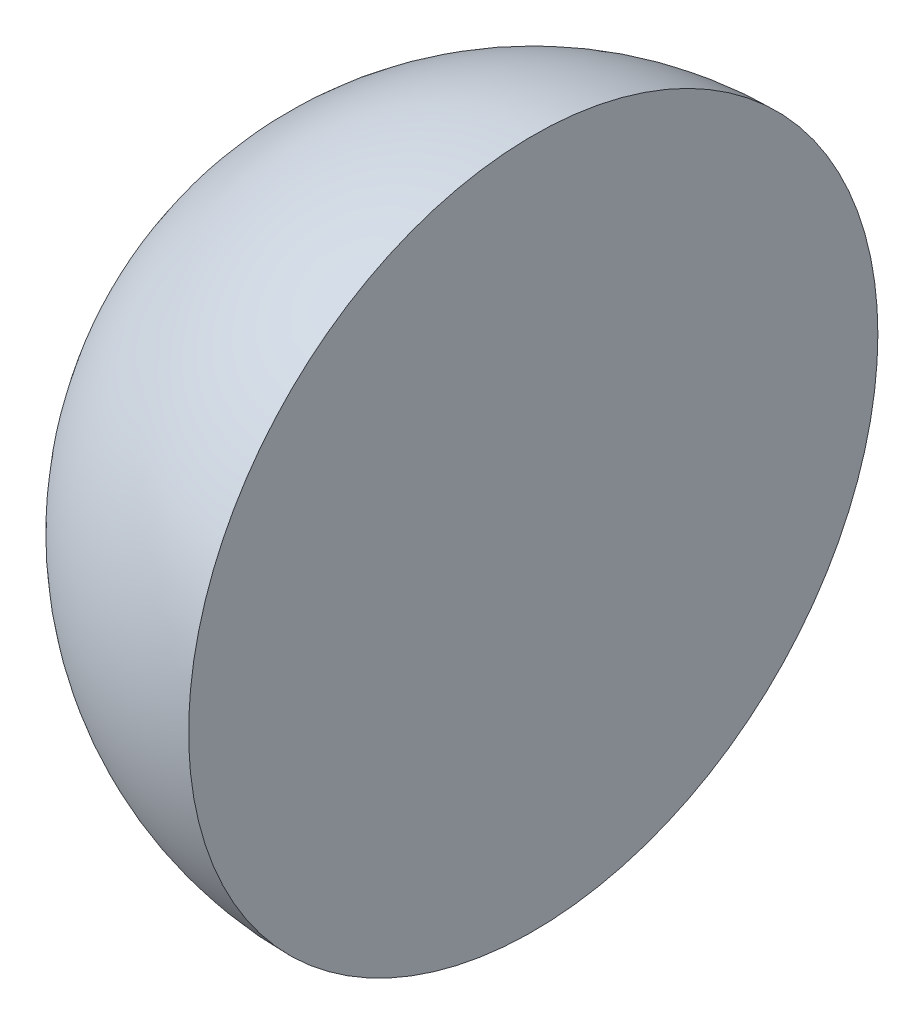
ISO-10303-21;
HEADER;
FILE_DESCRIPTION(('STEP AP214'),'2;1');
FILE_NAME('part.step','',(''),(''),'','','');
FILE_SCHEMA(('AUTOMOTIVE_DESIGN { 1 0 10303 214 1 1 1 1 }'));
ENDSEC;
DATA;
#1=APPLICATION_CONTEXT('core data for automotive mechanical design processes');
#2=APPLICATION_PROTOCOL_DEFINITION('international standard','automotive_design',2000,#1);
#3=PRODUCT_CONTEXT('',#1,'mechanical');
#4=PRODUCT('Part','Part','',(#3));
#5=PRODUCT_RELATED_PRODUCT_CATEGORY('part','',(#4));
#6=PRODUCT_DEFINITION_FORMATION('','',#4);
#7=PRODUCT_DEFINITION_CONTEXT('part definition',#1,'design');
#8=PRODUCT_DEFINITION('design','',#6,#7);
#9=PRODUCT_DEFINITION_SHAPE('','',#8);
#10=(LENGTH_UNIT() NAMED_UNIT(*) SI_UNIT(.MILLI.,.METRE.));
#11=(NAMED_UNIT(*) PLANE_ANGLE_UNIT() SI_UNIT($,.RADIAN.));
#12=(NAMED_UNIT(*) SI_UNIT($,.STERADIAN.) SOLID_ANGLE_UNIT());
#13=UNCERTAINTY_MEASURE_WITH_UNIT(LENGTH_MEASURE(1.E-05),#10,'distance_accuracy_value','');
#14=(GEOMETRIC_REPRESENTATION_CONTEXT(3) GLOBAL_UNCERTAINTY_ASSIGNED_CONTEXT((#13)) GLOBAL_UNIT_ASSIGNED_CONTEXT((#10,
#11,#12)) REPRESENTATION_CONTEXT('',''));
#15=CARTESIAN_POINT('',(0.,0.,0.));
#16=DIRECTION('',(0.,0.,1.));
#17=DIRECTION('',(1.,0.,0.));
#18=AXIS2_PLACEMENT_3D('',#15,#16,#17);
#19=CARTESIAN_POINT('',(3.27680321592632E-13,57.9306389810264,0.));
#20=DIRECTION('',(0.,1.,0.));
#21=DIRECTION('',(-1.,0.,0.));
#22=AXIS2_PLACEMENT_3D('',#19,#20,#21);
#23=SPHERICAL_SURFACE('',#22,95.25);
#24=CARTESIAN_POINT('',(3.27680321592632E-13,57.9306389810264,0.));
#25=DIRECTION('',(1.,0.,0.));
#26=DIRECTION('',(0.,0.,-1.));
#27=AXIS2_PLACEMENT_3D('',#24,#25,#26);
#28=SPHERICAL_SURFACE('',#27,95.25);
#29=CARTESIAN_POINT('',(0.,57.9306389810264,0.));
#30=DIRECTION('',(1.,0.,0.));
#31=DIRECTION('',(0.,0.,-1.));
#32=AXIS2_PLACEMENT_3D('',#29,#30,#31);
#33=CIRCLE('',#32,95.25);
#34=CARTESIAN_POINT('',(0.,57.9306389810264,-95.25));
#35=VERTEX_POINT('',#34);
#36=EDGE_CURVE('E10',#35,#35,#33,.T.);
#37=ORIENTED_EDGE('',*,*,#36,.F.);
#38=EDGE_LOOP('',(#37));
#39=FACE_BOUND('',#38,.T.);
#40=ADVANCED_FACE('F32',(#39),#28,.T.);
#41=CARTESIAN_POINT('',(0.,0.,0.));
#42=DIRECTION('',(1.,0.,0.));
#43=DIRECTION('',(0.,0.,-1.));
#44=AXIS2_PLACEMENT_3D('',#41,#42,#43);
#45=PLANE('',#44);
#46=ORIENTED_EDGE('',*,*,#36,.T.);
#47=EDGE_LOOP('',(#46));
#48=FACE_BOUND('',#47,.T.);
#49=ADVANCED_FACE('F39',(#48),#45,.T.);
#50=CLOSED_SHELL('',(#40,#49));
#51=MANIFOLD_SOLID_BREP('B2',#50);
#52=ADVANCED_BREP_SHAPE_REPRESENTATION('',(#18,#51),#14);
#53=SHAPE_DEFINITION_REPRESENTATION(#9,#52);
ENDSEC;
END-ISO-10303-21;
